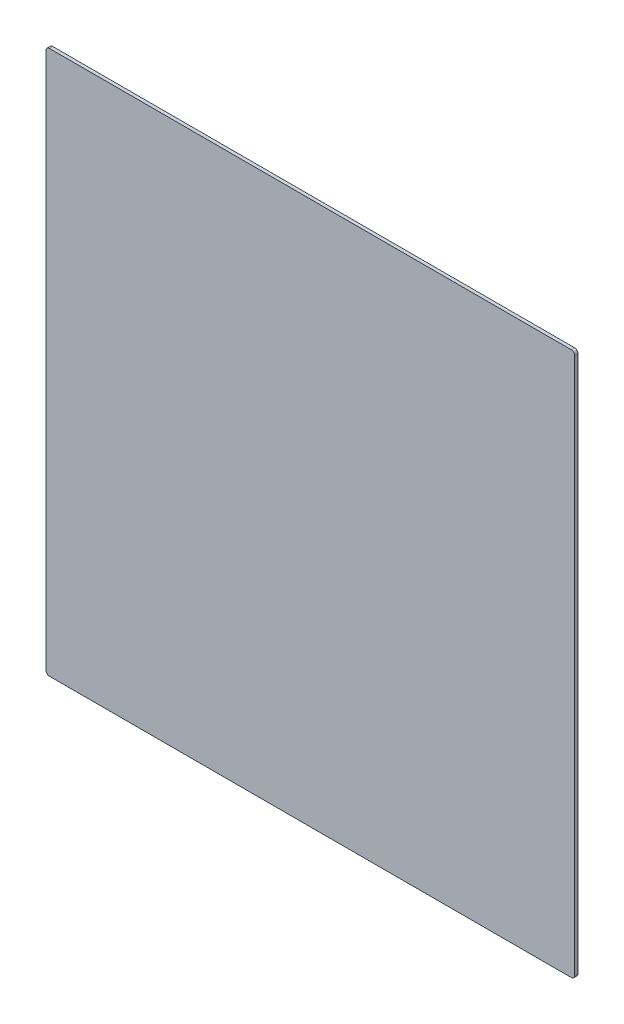
ISO-10303-21;
HEADER;
FILE_DESCRIPTION(('STEP AP214'),'2;1');
FILE_NAME('part.step','',(''),(''),'','','');
FILE_SCHEMA(('AUTOMOTIVE_DESIGN { 1 0 10303 214 1 1 1 1 }'));
ENDSEC;
DATA;
#1=APPLICATION_CONTEXT('core data for automotive mechanical design processes');
#2=APPLICATION_PROTOCOL_DEFINITION('international standard','automotive_design',2000,#1);
#3=PRODUCT_CONTEXT('',#1,'mechanical');
#4=PRODUCT('Part','Part','',(#3));
#5=PRODUCT_RELATED_PRODUCT_CATEGORY('part','',(#4));
#6=PRODUCT_DEFINITION_FORMATION('','',#4);
#7=PRODUCT_DEFINITION_CONTEXT('part definition',#1,'design');
#8=PRODUCT_DEFINITION('design','',#6,#7);
#9=PRODUCT_DEFINITION_SHAPE('','',#8);
#10=(LENGTH_UNIT() NAMED_UNIT(*) SI_UNIT(.MILLI.,.METRE.));
#11=(NAMED_UNIT(*) PLANE_ANGLE_UNIT() SI_UNIT($,.RADIAN.));
#12=(NAMED_UNIT(*) SI_UNIT($,.STERADIAN.) SOLID_ANGLE_UNIT());
#13=UNCERTAINTY_MEASURE_WITH_UNIT(LENGTH_MEASURE(1.E-05),#10,'distance_accuracy_value','');
#14=(GEOMETRIC_REPRESENTATION_CONTEXT(3) GLOBAL_UNCERTAINTY_ASSIGNED_CONTEXT((#13)) GLOBAL_UNIT_ASSIGNED_CONTEXT((#10,
#11,#12)) REPRESENTATION_CONTEXT('',''));
#15=CARTESIAN_POINT('',(0.,0.,0.));
#16=DIRECTION('',(0.,0.,1.));
#17=DIRECTION('',(1.,0.,0.));
#18=AXIS2_PLACEMENT_3D('',#15,#16,#17);
#19=CARTESIAN_POINT('',(-247.65,-254.79375,3.175));
#20=DIRECTION('',(0.,0.,-1.));
#21=DIRECTION('',(-1.,0.,0.));
#22=AXIS2_PLACEMENT_3D('',#19,#20,#21);
#23=CYLINDRICAL_SURFACE('',#22,3.175);
#24=CARTESIAN_POINT('',(-247.65,-254.79375,0.));
#25=DIRECTION('',(0.,0.,1.));
#26=DIRECTION('',(-1.,0.,0.));
#27=AXIS2_PLACEMENT_3D('',#24,#25,#26);
#28=CIRCLE('',#27,3.175);
#29=CARTESIAN_POINT('',(-250.825,-254.79375,0.));
#30=VERTEX_POINT('',#29);
#31=CARTESIAN_POINT('',(-247.65,-257.96875,0.));
#32=VERTEX_POINT('',#31);
#33=EDGE_CURVE('E128',#30,#32,#28,.T.);
#34=ORIENTED_EDGE('',*,*,#33,.T.);
#35=DIRECTION('',(0.,0.,-1.));
#36=VECTOR('',#35,1.);
#37=CARTESIAN_POINT('',(-247.65,-257.96875,3.175));
#38=LINE('',#37,#36);
#39=CARTESIAN_POINT('',(-247.65,-257.96875,3.175));
#40=VERTEX_POINT('',#39);
#41=EDGE_CURVE('E11',#40,#32,#38,.T.);
#42=ORIENTED_EDGE('',*,*,#41,.F.);
#43=CARTESIAN_POINT('',(-247.65,-254.79375,3.175));
#44=DIRECTION('',(0.,0.,1.));
#45=DIRECTION('',(-1.,0.,0.));
#46=AXIS2_PLACEMENT_3D('',#43,#44,#45);
#47=CIRCLE('',#46,3.175);
#48=CARTESIAN_POINT('',(-250.825,-254.79375,3.175));
#49=VERTEX_POINT('',#48);
#50=EDGE_CURVE('E142',#49,#40,#47,.T.);
#51=ORIENTED_EDGE('',*,*,#50,.F.);
#52=DIRECTION('',(0.,0.,-1.));
#53=VECTOR('',#52,1.);
#54=CARTESIAN_POINT('',(-250.825,-254.79375,3.175));
#55=LINE('',#54,#53);
#56=EDGE_CURVE('E124',#49,#30,#55,.T.);
#57=ORIENTED_EDGE('',*,*,#56,.T.);
#58=EDGE_LOOP('',(#34,#42,#51,#57));
#59=FACE_BOUND('',#58,.T.);
#60=ADVANCED_FACE('F32',(#59),#23,.T.);
#61=CARTESIAN_POINT('',(-247.65,-257.96875,3.175));
#62=DIRECTION('',(0.,1.,0.));
#63=DIRECTION('',(0.,0.,1.));
#64=AXIS2_PLACEMENT_3D('',#61,#62,#63);
#65=PLANE('',#64);
#66=DIRECTION('',(1.,0.,0.));
#67=VECTOR('',#66,1.);
#68=CARTESIAN_POINT('',(-247.65,-257.96875,0.));
#69=LINE('',#68,#67);
#70=CARTESIAN_POINT('',(247.65,-257.96875,0.));
#71=VERTEX_POINT('',#70);
#72=EDGE_CURVE('E131',#32,#71,#69,.T.);
#73=ORIENTED_EDGE('',*,*,#72,.T.);
#74=DIRECTION('',(0.,0.,-1.));
#75=VECTOR('',#74,1.);
#76=CARTESIAN_POINT('',(247.65,-257.96875,3.175));
#77=LINE('',#76,#75);
#78=CARTESIAN_POINT('',(247.65,-257.96875,3.175));
#79=VERTEX_POINT('',#78);
#80=EDGE_CURVE('E40',#79,#71,#77,.T.);
#81=ORIENTED_EDGE('',*,*,#80,.F.);
#82=DIRECTION('',(1.,0.,0.));
#83=VECTOR('',#82,1.);
#84=CARTESIAN_POINT('',(-247.65,-257.96875,3.175));
#85=LINE('',#84,#83);
#86=EDGE_CURVE('E91',#40,#79,#85,.T.);
#87=ORIENTED_EDGE('',*,*,#86,.F.);
#88=ORIENTED_EDGE('',*,*,#41,.T.);
#89=EDGE_LOOP('',(#73,#81,#87,#88));
#90=FACE_BOUND('',#89,.T.);
#91=ADVANCED_FACE('F177',(#90),#65,.F.);
#92=CARTESIAN_POINT('',(247.65,-254.79375,3.175));
#93=DIRECTION('',(0.,0.,-1.));
#94=DIRECTION('',(-1.,0.,0.));
#95=AXIS2_PLACEMENT_3D('',#92,#93,#94);
#96=CYLINDRICAL_SURFACE('',#95,3.175);
#97=CARTESIAN_POINT('',(247.65,-254.79375,0.));
#98=DIRECTION('',(0.,0.,1.));
#99=DIRECTION('',(1.,0.,0.));
#100=AXIS2_PLACEMENT_3D('',#97,#98,#99);
#101=CIRCLE('',#100,3.175);
#102=CARTESIAN_POINT('',(250.825,-254.79375,0.));
#103=VERTEX_POINT('',#102);
#104=EDGE_CURVE('E133',#71,#103,#101,.T.);
#105=ORIENTED_EDGE('',*,*,#104,.T.);
#106=DIRECTION('',(0.,0.,-1.));
#107=VECTOR('',#106,1.);
#108=CARTESIAN_POINT('',(250.825,-254.79375,3.175));
#109=LINE('',#108,#107);
#110=CARTESIAN_POINT('',(250.825,-254.79375,3.175));
#111=VERTEX_POINT('',#110);
#112=EDGE_CURVE('E149',#111,#103,#109,.T.);
#113=ORIENTED_EDGE('',*,*,#112,.F.);
#114=CARTESIAN_POINT('',(247.65,-254.79375,3.175));
#115=DIRECTION('',(0.,0.,1.));
#116=DIRECTION('',(1.,0.,0.));
#117=AXIS2_PLACEMENT_3D('',#114,#115,#116);
#118=CIRCLE('',#117,3.175);
#119=EDGE_CURVE('E157',#79,#111,#118,.T.);
#120=ORIENTED_EDGE('',*,*,#119,.F.);
#121=ORIENTED_EDGE('',*,*,#80,.T.);
#122=EDGE_LOOP('',(#105,#113,#120,#121));
#123=FACE_BOUND('',#122,.T.);
#124=ADVANCED_FACE('F155',(#123),#96,.T.);
#125=CARTESIAN_POINT('',(250.825,-254.79375,3.175));
#126=DIRECTION('',(-1.,0.,0.));
#127=DIRECTION('',(0.,0.,1.));
#128=AXIS2_PLACEMENT_3D('',#125,#126,#127);
#129=PLANE('',#128);
#130=DIRECTION('',(0.,1.,0.));
#131=VECTOR('',#130,1.);
#132=CARTESIAN_POINT('',(250.825,-254.79375,0.));
#133=LINE('',#132,#131);
#134=CARTESIAN_POINT('',(250.825,254.79375,0.));
#135=VERTEX_POINT('',#134);
#136=EDGE_CURVE('E135',#103,#135,#133,.T.);
#137=ORIENTED_EDGE('',*,*,#136,.T.);
#138=DIRECTION('',(0.,0.,-1.));
#139=VECTOR('',#138,1.);
#140=CARTESIAN_POINT('',(250.825,254.79375,3.175));
#141=LINE('',#140,#139);
#142=CARTESIAN_POINT('',(250.825,254.79375,3.175));
#143=VERTEX_POINT('',#142);
#144=EDGE_CURVE('E146',#143,#135,#141,.T.);
#145=ORIENTED_EDGE('',*,*,#144,.F.);
#146=DIRECTION('',(0.,1.,0.));
#147=VECTOR('',#146,1.);
#148=CARTESIAN_POINT('',(250.825,-254.79375,3.175));
#149=LINE('',#148,#147);
#150=EDGE_CURVE('E169',#111,#143,#149,.T.);
#151=ORIENTED_EDGE('',*,*,#150,.F.);
#152=ORIENTED_EDGE('',*,*,#112,.T.);
#153=EDGE_LOOP('',(#137,#145,#151,#152));
#154=FACE_BOUND('',#153,.T.);
#155=ADVANCED_FACE('F165',(#154),#129,.F.);
#156=CARTESIAN_POINT('',(247.65,254.79375,3.175));
#157=DIRECTION('',(0.,0.,-1.));
#158=DIRECTION('',(-1.,0.,0.));
#159=AXIS2_PLACEMENT_3D('',#156,#157,#158);
#160=CYLINDRICAL_SURFACE('',#159,3.175);
#161=CARTESIAN_POINT('',(247.65,254.79375,0.));
#162=DIRECTION('',(0.,0.,1.));
#163=DIRECTION('',(-1.,0.,0.));
#164=AXIS2_PLACEMENT_3D('',#161,#162,#163);
#165=CIRCLE('',#164,3.175);
#166=CARTESIAN_POINT('',(247.65,257.96875,0.));
#167=VERTEX_POINT('',#166);
#168=EDGE_CURVE('E137',#135,#167,#165,.T.);
#169=ORIENTED_EDGE('',*,*,#168,.T.);
#170=DIRECTION('',(0.,0.,-1.));
#171=VECTOR('',#170,1.);
#172=CARTESIAN_POINT('',(247.65,257.96875,3.175));
#173=LINE('',#172,#171);
#174=CARTESIAN_POINT('',(247.65,257.96875,3.175));
#175=VERTEX_POINT('',#174);
#176=EDGE_CURVE('E119',#175,#167,#173,.T.);
#177=ORIENTED_EDGE('',*,*,#176,.F.);
#178=CARTESIAN_POINT('',(247.65,254.79375,3.175));
#179=DIRECTION('',(0.,0.,1.));
#180=DIRECTION('',(-1.,0.,0.));
#181=AXIS2_PLACEMENT_3D('',#178,#179,#180);
#182=CIRCLE('',#181,3.175);
#183=EDGE_CURVE('E110',#143,#175,#182,.T.);
#184=ORIENTED_EDGE('',*,*,#183,.F.);
#185=ORIENTED_EDGE('',*,*,#144,.T.);
#186=EDGE_LOOP('',(#169,#177,#184,#185));
#187=FACE_BOUND('',#186,.T.);
#188=ADVANCED_FACE('F168',(#187),#160,.T.);
#189=CARTESIAN_POINT('',(-247.65,257.96875,3.175));
#190=DIRECTION('',(0.,-1.,0.));
#191=DIRECTION('',(0.,0.,-1.));
#192=AXIS2_PLACEMENT_3D('',#189,#190,#191);
#193=PLANE('',#192);
#194=DIRECTION('',(-1.,0.,0.));
#195=VECTOR('',#194,1.);
#196=CARTESIAN_POINT('',(-247.65,257.96875,0.));
#197=LINE('',#196,#195);
#198=CARTESIAN_POINT('',(-247.65,257.96875,0.));
#199=VERTEX_POINT('',#198);
#200=EDGE_CURVE('E118',#167,#199,#197,.T.);
#201=ORIENTED_EDGE('',*,*,#200,.T.);
#202=DIRECTION('',(0.,0.,-1.));
#203=VECTOR('',#202,1.);
#204=CARTESIAN_POINT('',(-247.65,257.96875,3.175));
#205=LINE('',#204,#203);
#206=CARTESIAN_POINT('',(-247.65,257.96875,3.175));
#207=VERTEX_POINT('',#206);
#208=EDGE_CURVE('E115',#207,#199,#205,.T.);
#209=ORIENTED_EDGE('',*,*,#208,.F.);
#210=DIRECTION('',(-1.,0.,0.));
#211=VECTOR('',#210,1.);
#212=CARTESIAN_POINT('',(-247.65,257.96875,3.175));
#213=LINE('',#212,#211);
#214=EDGE_CURVE('E104',#175,#207,#213,.T.);
#215=ORIENTED_EDGE('',*,*,#214,.F.);
#216=ORIENTED_EDGE('',*,*,#176,.T.);
#217=EDGE_LOOP('',(#201,#209,#215,#216));
#218=FACE_BOUND('',#217,.T.);
#219=ADVANCED_FACE('F116',(#218),#193,.F.);
#220=CARTESIAN_POINT('',(-247.65,254.79375,3.175));
#221=DIRECTION('',(0.,0.,-1.));
#222=DIRECTION('',(-1.,0.,0.));
#223=AXIS2_PLACEMENT_3D('',#220,#221,#222);
#224=CYLINDRICAL_SURFACE('',#223,3.175);
#225=CARTESIAN_POINT('',(-247.65,254.79375,0.));
#226=DIRECTION('',(0.,0.,1.));
#227=DIRECTION('',(-1.,0.,0.));
#228=AXIS2_PLACEMENT_3D('',#225,#226,#227);
#229=CIRCLE('',#228,3.175);
#230=CARTESIAN_POINT('',(-250.825,254.79375,0.));
#231=VERTEX_POINT('',#230);
#232=EDGE_CURVE('E77',#199,#231,#229,.T.);
#233=ORIENTED_EDGE('',*,*,#232,.T.);
#234=DIRECTION('',(0.,0.,-1.));
#235=VECTOR('',#234,1.);
#236=CARTESIAN_POINT('',(-250.825,254.79375,3.175));
#237=LINE('',#236,#235);
#238=CARTESIAN_POINT('',(-250.825,254.79375,3.175));
#239=VERTEX_POINT('',#238);
#240=EDGE_CURVE('E120',#239,#231,#237,.T.);
#241=ORIENTED_EDGE('',*,*,#240,.F.);
#242=CARTESIAN_POINT('',(-247.65,254.79375,3.175));
#243=DIRECTION('',(0.,0.,1.));
#244=DIRECTION('',(-1.,0.,0.));
#245=AXIS2_PLACEMENT_3D('',#242,#243,#244);
#246=CIRCLE('',#245,3.175);
#247=EDGE_CURVE('E108',#207,#239,#246,.T.);
#248=ORIENTED_EDGE('',*,*,#247,.F.);
#249=ORIENTED_EDGE('',*,*,#208,.T.);
#250=EDGE_LOOP('',(#233,#241,#248,#249));
#251=FACE_BOUND('',#250,.T.);
#252=ADVANCED_FACE('F122',(#251),#224,.T.);
#253=CARTESIAN_POINT('',(-250.825,-254.79375,3.175));
#254=DIRECTION('',(1.,0.,0.));
#255=DIRECTION('',(0.,0.,-1.));
#256=AXIS2_PLACEMENT_3D('',#253,#254,#255);
#257=PLANE('',#256);
#258=DIRECTION('',(0.,-1.,0.));
#259=VECTOR('',#258,1.);
#260=CARTESIAN_POINT('',(-250.825,-254.79375,0.));
#261=LINE('',#260,#259);
#262=EDGE_CURVE('E83',#231,#30,#261,.T.);
#263=ORIENTED_EDGE('',*,*,#262,.T.);
#264=ORIENTED_EDGE('',*,*,#56,.F.);
#265=DIRECTION('',(0.,-1.,0.));
#266=VECTOR('',#265,1.);
#267=CARTESIAN_POINT('',(-250.825,-254.79375,3.175));
#268=LINE('',#267,#266);
#269=EDGE_CURVE('E48',#239,#49,#268,.T.);
#270=ORIENTED_EDGE('',*,*,#269,.F.);
#271=ORIENTED_EDGE('',*,*,#240,.T.);
#272=EDGE_LOOP('',(#263,#264,#270,#271));
#273=FACE_BOUND('',#272,.T.);
#274=ADVANCED_FACE('F193',(#273),#257,.F.);
#275=CARTESIAN_POINT('',(-247.65,-254.79375,3.175));
#276=DIRECTION('',(0.,0.,-1.));
#277=DIRECTION('',(-1.,0.,0.));
#278=AXIS2_PLACEMENT_3D('',#275,#276,#277);
#279=PLANE('',#278);
#280=ORIENTED_EDGE('',*,*,#50,.T.);
#281=ORIENTED_EDGE('',*,*,#86,.T.);
#282=ORIENTED_EDGE('',*,*,#119,.T.);
#283=ORIENTED_EDGE('',*,*,#150,.T.);
#284=ORIENTED_EDGE('',*,*,#183,.T.);
#285=ORIENTED_EDGE('',*,*,#214,.T.);
#286=ORIENTED_EDGE('',*,*,#247,.T.);
#287=ORIENTED_EDGE('',*,*,#269,.T.);
#288=EDGE_LOOP('',(#280,#281,#282,#283,#284,#285,#286,#287));
#289=FACE_BOUND('',#288,.T.);
#290=ADVANCED_FACE('F106',(#289),#279,.F.);
#291=CARTESIAN_POINT('',(-247.65,-254.79375,0.));
#292=DIRECTION('',(0.,0.,-1.));
#293=DIRECTION('',(-1.,0.,0.));
#294=AXIS2_PLACEMENT_3D('',#291,#292,#293);
#295=PLANE('',#294);
#296=ORIENTED_EDGE('',*,*,#33,.F.);
#297=ORIENTED_EDGE('',*,*,#262,.F.);
#298=ORIENTED_EDGE('',*,*,#232,.F.);
#299=ORIENTED_EDGE('',*,*,#200,.F.);
#300=ORIENTED_EDGE('',*,*,#168,.F.);
#301=ORIENTED_EDGE('',*,*,#136,.F.);
#302=ORIENTED_EDGE('',*,*,#104,.F.);
#303=ORIENTED_EDGE('',*,*,#72,.F.);
#304=EDGE_LOOP('',(#296,#297,#298,#299,#300,#301,#302,#303));
#305=FACE_BOUND('',#304,.T.);
#306=ADVANCED_FACE('F161',(#305),#295,.T.);
#307=CLOSED_SHELL('',(#60,#91,#124,#155,#188,#219,#252,#274,#290,#306));
#308=MANIFOLD_SOLID_BREP('B2',#307);
#309=ADVANCED_BREP_SHAPE_REPRESENTATION('',(#18,#308),#14);
#310=SHAPE_DEFINITION_REPRESENTATION(#9,#309);
ENDSEC;
END-ISO-10303-21;
